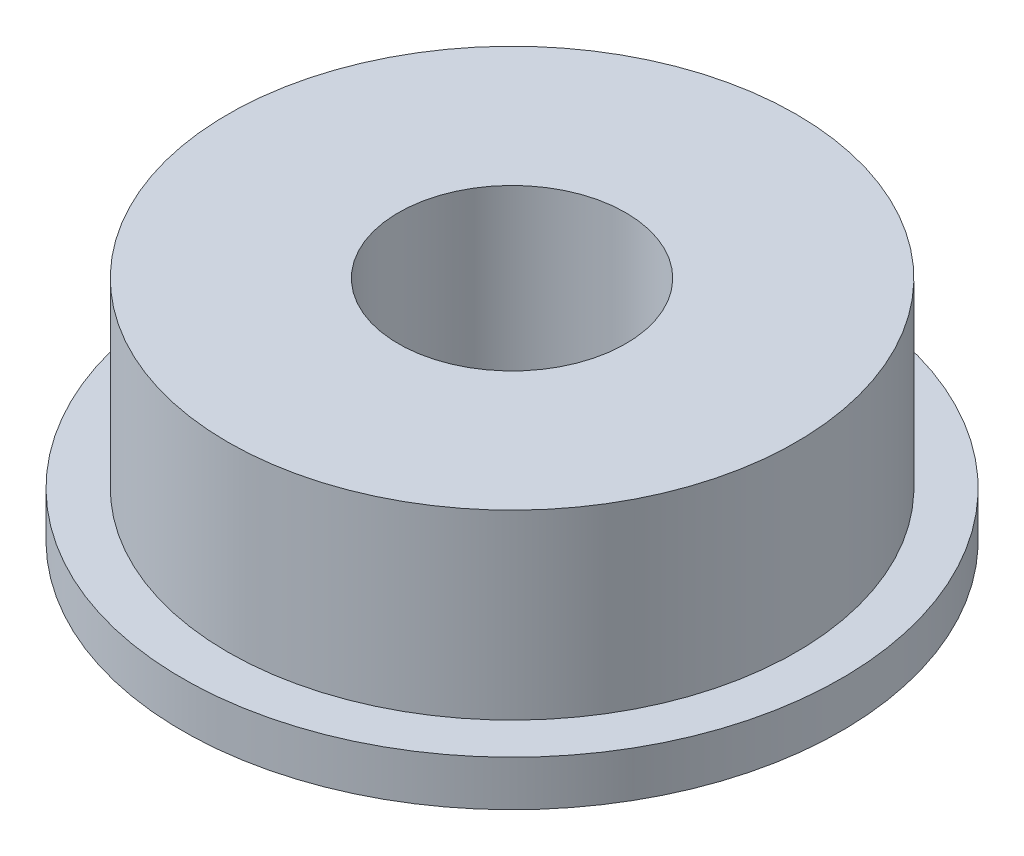
ISO-10303-21;
HEADER;
FILE_DESCRIPTION(('STEP AP214'),'2;1');
FILE_NAME('part.step','',(''),(''),'','','');
FILE_SCHEMA(('AUTOMOTIVE_DESIGN { 1 0 10303 214 1 1 1 1 }'));
ENDSEC;
DATA;
#1=APPLICATION_CONTEXT('core data for automotive mechanical design processes');
#2=APPLICATION_PROTOCOL_DEFINITION('international standard','automotive_design',2000,#1);
#3=PRODUCT_CONTEXT('',#1,'mechanical');
#4=PRODUCT('Part','Part','',(#3));
#5=PRODUCT_RELATED_PRODUCT_CATEGORY('part','',(#4));
#6=PRODUCT_DEFINITION_FORMATION('','',#4);
#7=PRODUCT_DEFINITION_CONTEXT('part definition',#1,'design');
#8=PRODUCT_DEFINITION('design','',#6,#7);
#9=PRODUCT_DEFINITION_SHAPE('','',#8);
#10=(LENGTH_UNIT() NAMED_UNIT(*) SI_UNIT(.MILLI.,.METRE.));
#11=(NAMED_UNIT(*) PLANE_ANGLE_UNIT() SI_UNIT($,.RADIAN.));
#12=(NAMED_UNIT(*) SI_UNIT($,.STERADIAN.) SOLID_ANGLE_UNIT());
#13=UNCERTAINTY_MEASURE_WITH_UNIT(LENGTH_MEASURE(1.E-05),#10,'distance_accuracy_value','');
#14=(GEOMETRIC_REPRESENTATION_CONTEXT(3) GLOBAL_UNCERTAINTY_ASSIGNED_CONTEXT((#13)) GLOBAL_UNIT_ASSIGNED_CONTEXT((#10,
#11,#12)) REPRESENTATION_CONTEXT('',''));
#15=CARTESIAN_POINT('',(0.,0.,0.));
#16=DIRECTION('',(0.,0.,1.));
#17=DIRECTION('',(1.,0.,0.));
#18=AXIS2_PLACEMENT_3D('',#15,#16,#17);
#19=CARTESIAN_POINT('',(5.,4.,0.));
#20=DIRECTION('',(0.,1.,0.));
#21=DIRECTION('',(0.,0.,1.));
#22=AXIS2_PLACEMENT_3D('',#19,#20,#21);
#23=PLANE('',#22);
#24=CARTESIAN_POINT('',(0.,4.,0.));
#25=DIRECTION('',(0.,-1.,0.));
#26=DIRECTION('',(0.,0.,-1.));
#27=AXIS2_PLACEMENT_3D('',#24,#25,#26);
#28=CIRCLE('',#27,2.);
#29=CARTESIAN_POINT('',(0.,4.,-2.));
#30=VERTEX_POINT('',#29);
#31=EDGE_CURVE('E10',#30,#30,#28,.T.);
#32=ORIENTED_EDGE('',*,*,#31,.T.);
#33=EDGE_LOOP('',(#32));
#34=FACE_BOUND('',#33,.T.);
#35=CARTESIAN_POINT('',(0.,4.,0.));
#36=DIRECTION('',(0.,-1.,0.));
#37=DIRECTION('',(0.,0.,-1.));
#38=AXIS2_PLACEMENT_3D('',#35,#36,#37);
#39=CIRCLE('',#38,5.);
#40=CARTESIAN_POINT('',(0.,4.,-5.));
#41=VERTEX_POINT('',#40);
#42=EDGE_CURVE('E55',#41,#41,#39,.T.);
#43=ORIENTED_EDGE('',*,*,#42,.F.);
#44=EDGE_LOOP('',(#43));
#45=FACE_BOUND('',#44,.T.);
#46=ADVANCED_FACE('F33',(#34,#45),#23,.T.);
#47=CARTESIAN_POINT('',(0.,0.,0.));
#48=DIRECTION('',(0.,-1.,0.));
#49=DIRECTION('',(0.,0.,-1.));
#50=AXIS2_PLACEMENT_3D('',#47,#48,#49);
#51=CYLINDRICAL_SURFACE('',#50,2.);
#52=CARTESIAN_POINT('',(0.,0.,0.));
#53=DIRECTION('',(0.,-1.,0.));
#54=DIRECTION('',(0.,0.,-1.));
#55=AXIS2_PLACEMENT_3D('',#52,#53,#54);
#56=CIRCLE('',#55,2.);
#57=CARTESIAN_POINT('',(0.,0.,-2.));
#58=VERTEX_POINT('',#57);
#59=EDGE_CURVE('E39',#58,#58,#56,.T.);
#60=ORIENTED_EDGE('',*,*,#59,.T.);
#61=EDGE_LOOP('',(#60));
#62=FACE_BOUND('',#61,.T.);
#63=ORIENTED_EDGE('',*,*,#31,.F.);
#64=EDGE_LOOP('',(#63));
#65=FACE_BOUND('',#64,.T.);
#66=ADVANCED_FACE('F63',(#62,#65),#51,.F.);
#67=CARTESIAN_POINT('',(2.,0.,0.));
#68=DIRECTION('',(0.,-1.,0.));
#69=DIRECTION('',(0.,0.,-1.));
#70=AXIS2_PLACEMENT_3D('',#67,#68,#69);
#71=PLANE('',#70);
#72=CARTESIAN_POINT('',(0.,0.,0.));
#73=DIRECTION('',(0.,-1.,0.));
#74=DIRECTION('',(0.,0.,-1.));
#75=AXIS2_PLACEMENT_3D('',#72,#73,#74);
#76=CIRCLE('',#75,5.8);
#77=CARTESIAN_POINT('',(0.,0.,-5.8));
#78=VERTEX_POINT('',#77);
#79=EDGE_CURVE('E43',#78,#78,#76,.T.);
#80=ORIENTED_EDGE('',*,*,#79,.T.);
#81=EDGE_LOOP('',(#80));
#82=FACE_BOUND('',#81,.T.);
#83=ORIENTED_EDGE('',*,*,#59,.F.);
#84=EDGE_LOOP('',(#83));
#85=FACE_BOUND('',#84,.T.);
#86=ADVANCED_FACE('F67',(#82,#85),#71,.T.);
#87=CARTESIAN_POINT('',(0.,0.,0.));
#88=DIRECTION('',(0.,-1.,0.));
#89=DIRECTION('',(0.,0.,-1.));
#90=AXIS2_PLACEMENT_3D('',#87,#88,#89);
#91=CYLINDRICAL_SURFACE('',#90,5.8);
#92=CARTESIAN_POINT('',(0.,0.8,0.));
#93=DIRECTION('',(0.,-1.,0.));
#94=DIRECTION('',(0.,0.,-1.));
#95=AXIS2_PLACEMENT_3D('',#92,#93,#94);
#96=CIRCLE('',#95,5.8);
#97=CARTESIAN_POINT('',(0.,0.8,-5.8));
#98=VERTEX_POINT('',#97);
#99=EDGE_CURVE('E47',#98,#98,#96,.T.);
#100=ORIENTED_EDGE('',*,*,#99,.T.);
#101=EDGE_LOOP('',(#100));
#102=FACE_BOUND('',#101,.T.);
#103=ORIENTED_EDGE('',*,*,#79,.F.);
#104=EDGE_LOOP('',(#103));
#105=FACE_BOUND('',#104,.T.);
#106=ADVANCED_FACE('F71',(#102,#105),#91,.T.);
#107=CARTESIAN_POINT('',(5.8,0.8,0.));
#108=DIRECTION('',(0.,1.,0.));
#109=DIRECTION('',(0.,0.,1.));
#110=AXIS2_PLACEMENT_3D('',#107,#108,#109);
#111=PLANE('',#110);
#112=CARTESIAN_POINT('',(0.,0.8,0.));
#113=DIRECTION('',(0.,-1.,0.));
#114=DIRECTION('',(0.,0.,-1.));
#115=AXIS2_PLACEMENT_3D('',#112,#113,#114);
#116=CIRCLE('',#115,5.);
#117=CARTESIAN_POINT('',(0.,0.8,-5.));
#118=VERTEX_POINT('',#117);
#119=EDGE_CURVE('E52',#118,#118,#116,.T.);
#120=ORIENTED_EDGE('',*,*,#119,.T.);
#121=EDGE_LOOP('',(#120));
#122=FACE_BOUND('',#121,.T.);
#123=ORIENTED_EDGE('',*,*,#99,.F.);
#124=EDGE_LOOP('',(#123));
#125=FACE_BOUND('',#124,.T.);
#126=ADVANCED_FACE('F78',(#122,#125),#111,.T.);
#127=CARTESIAN_POINT('',(0.,0.,0.));
#128=DIRECTION('',(0.,-1.,0.));
#129=DIRECTION('',(0.,0.,-1.));
#130=AXIS2_PLACEMENT_3D('',#127,#128,#129);
#131=CYLINDRICAL_SURFACE('',#130,5.);
#132=ORIENTED_EDGE('',*,*,#42,.T.);
#133=EDGE_LOOP('',(#132));
#134=FACE_BOUND('',#133,.T.);
#135=ORIENTED_EDGE('',*,*,#119,.F.);
#136=EDGE_LOOP('',(#135));
#137=FACE_BOUND('',#136,.T.);
#138=ADVANCED_FACE('F59',(#134,#137),#131,.T.);
#139=CLOSED_SHELL('',(#46,#66,#86,#106,#126,#138));
#140=MANIFOLD_SOLID_BREP('B2',#139);
#141=ADVANCED_BREP_SHAPE_REPRESENTATION('',(#18,#140),#14);
#142=SHAPE_DEFINITION_REPRESENTATION(#9,#141);
ENDSEC;
END-ISO-10303-21;
